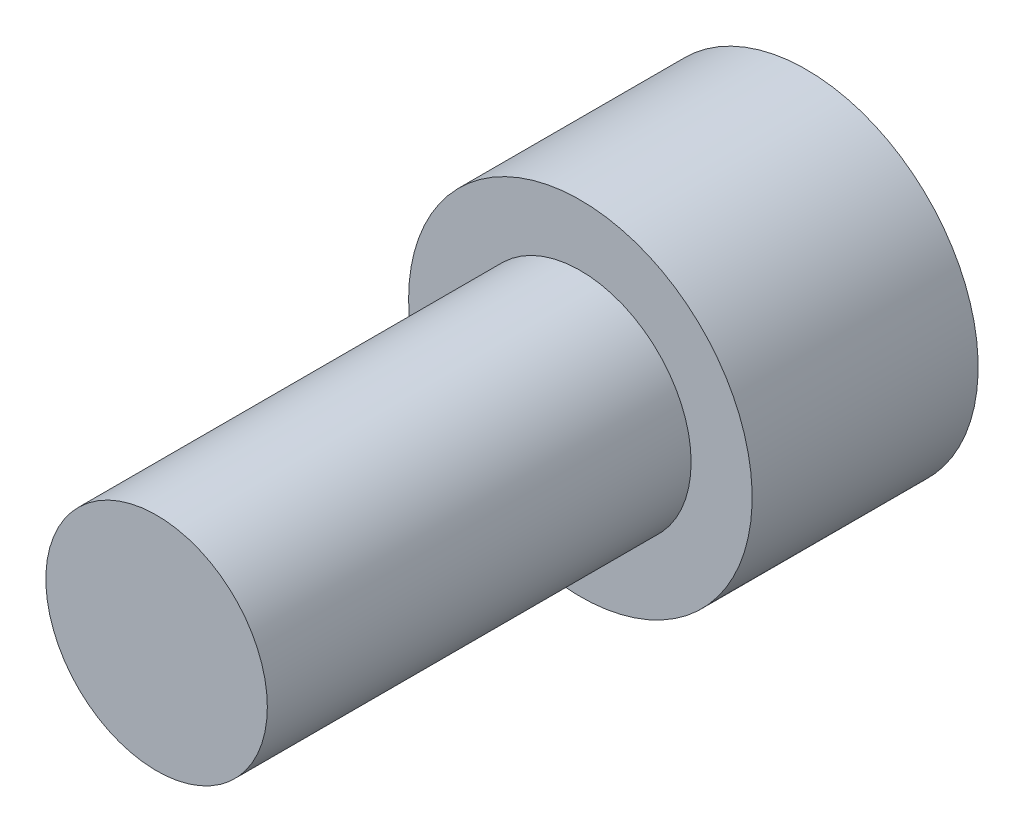
ISO-10303-21;
HEADER;
FILE_DESCRIPTION(('STEP AP214'),'2;1');
FILE_NAME('part.step','',(''),(''),'','','');
FILE_SCHEMA(('AUTOMOTIVE_DESIGN { 1 0 10303 214 1 1 1 1 }'));
ENDSEC;
DATA;
#1=APPLICATION_CONTEXT('core data for automotive mechanical design processes');
#2=APPLICATION_PROTOCOL_DEFINITION('international standard','automotive_design',2000,#1);
#3=PRODUCT_CONTEXT('',#1,'mechanical');
#4=PRODUCT('Part','Part','',(#3));
#5=PRODUCT_RELATED_PRODUCT_CATEGORY('part','',(#4));
#6=PRODUCT_DEFINITION_FORMATION('','',#4);
#7=PRODUCT_DEFINITION_CONTEXT('part definition',#1,'design');
#8=PRODUCT_DEFINITION('design','',#6,#7);
#9=PRODUCT_DEFINITION_SHAPE('','',#8);
#10=(LENGTH_UNIT() NAMED_UNIT(*) SI_UNIT(.MILLI.,.METRE.));
#11=(NAMED_UNIT(*) PLANE_ANGLE_UNIT() SI_UNIT($,.RADIAN.));
#12=(NAMED_UNIT(*) SI_UNIT($,.STERADIAN.) SOLID_ANGLE_UNIT());
#13=UNCERTAINTY_MEASURE_WITH_UNIT(LENGTH_MEASURE(1.E-05),#10,'distance_accuracy_value','');
#14=(GEOMETRIC_REPRESENTATION_CONTEXT(3) GLOBAL_UNCERTAINTY_ASSIGNED_CONTEXT((#13)) GLOBAL_UNIT_ASSIGNED_CONTEXT((#10,
#11,#12)) REPRESENTATION_CONTEXT('',''));
#15=CARTESIAN_POINT('',(0.,0.,0.));
#16=DIRECTION('',(0.,0.,1.));
#17=DIRECTION('',(1.,0.,0.));
#18=AXIS2_PLACEMENT_3D('',#15,#16,#17);
#19=CARTESIAN_POINT('',(0.,0.,14.605));
#20=DIRECTION('',(0.,0.,-1.));
#21=DIRECTION('',(-1.,0.,0.));
#22=AXIS2_PLACEMENT_3D('',#19,#20,#21);
#23=CYLINDRICAL_SURFACE('',#22,3.8608);
#24=CARTESIAN_POINT('',(0.,0.,0.));
#25=DIRECTION('',(0.,0.,1.));
#26=DIRECTION('',(1.,0.,0.));
#27=AXIS2_PLACEMENT_3D('',#24,#25,#26);
#28=CIRCLE('',#27,3.8608);
#29=CARTESIAN_POINT('',(-3.8608,0.,0.));
#30=VERTEX_POINT('',#29);
#31=EDGE_CURVE('E12',#30,#30,#28,.T.);
#32=CARTESIAN_POINT('',(0.,0.,5.08));
#33=DIRECTION('',(0.,0.,1.));
#34=DIRECTION('',(1.,0.,0.));
#35=AXIS2_PLACEMENT_3D('',#32,#33,#34);
#36=CIRCLE('',#35,3.8608);
#37=CARTESIAN_POINT('',(-3.8608,0.,5.08));
#38=VERTEX_POINT('',#37);
#39=EDGE_CURVE('E35',#38,#38,#36,.T.);
#40=CARTESIAN_POINT('',(-3.8608,0.,0.));
#41=CARTESIAN_POINT('',(-3.8608,0.,0.0529166666666664));
#42=CARTESIAN_POINT('',(-3.8608,0.,0.105833333333333));
#43=CARTESIAN_POINT('',(-3.8608,0.,0.211666666666666));
#44=CARTESIAN_POINT('',(-3.8608,0.,0.264583333333333));
#45=CARTESIAN_POINT('',(-3.8608,0.,0.370416666666666));
#46=CARTESIAN_POINT('',(-3.8608,0.,0.423333333333333));
#47=CARTESIAN_POINT('',(-3.8608,0.,0.529166666666666));
#48=CARTESIAN_POINT('',(-3.8608,0.,0.582083333333333));
#49=CARTESIAN_POINT('',(-3.8608,0.,0.687916666666667));
#50=CARTESIAN_POINT('',(-3.8608,0.,0.740833333333333));
#51=CARTESIAN_POINT('',(-3.8608,0.,0.846666666666666));
#52=CARTESIAN_POINT('',(-3.8608,0.,0.899583333333333));
#53=CARTESIAN_POINT('',(-3.8608,0.,1.00541666666667));
#54=CARTESIAN_POINT('',(-3.8608,0.,1.05833333333333));
#55=CARTESIAN_POINT('',(-3.8608,0.,1.16416666666667));
#56=CARTESIAN_POINT('',(-3.8608,0.,1.21708333333333));
#57=CARTESIAN_POINT('',(-3.8608,0.,1.32291666666667));
#58=CARTESIAN_POINT('',(-3.8608,0.,1.37583333333333));
#59=CARTESIAN_POINT('',(-3.8608,0.,1.48166666666667));
#60=CARTESIAN_POINT('',(-3.8608,0.,1.53458333333333));
#61=CARTESIAN_POINT('',(-3.8608,0.,1.64041666666667));
#62=CARTESIAN_POINT('',(-3.8608,0.,1.69333333333333));
#63=CARTESIAN_POINT('',(-3.8608,0.,1.79916666666667));
#64=CARTESIAN_POINT('',(-3.8608,0.,1.85208333333333));
#65=CARTESIAN_POINT('',(-3.8608,0.,1.95791666666667));
#66=CARTESIAN_POINT('',(-3.8608,0.,2.01083333333333));
#67=CARTESIAN_POINT('',(-3.8608,0.,2.11666666666667));
#68=CARTESIAN_POINT('',(-3.8608,0.,2.16958333333333));
#69=CARTESIAN_POINT('',(-3.8608,0.,2.27541666666667));
#70=CARTESIAN_POINT('',(-3.8608,0.,2.32833333333333));
#71=CARTESIAN_POINT('',(-3.8608,0.,2.43416666666666));
#72=CARTESIAN_POINT('',(-3.8608,0.,2.48708333333333));
#73=CARTESIAN_POINT('',(-3.8608,0.,2.59291666666667));
#74=CARTESIAN_POINT('',(-3.8608,0.,2.64583333333333));
#75=CARTESIAN_POINT('',(-3.8608,0.,2.75166666666667));
#76=CARTESIAN_POINT('',(-3.8608,0.,2.80458333333333));
#77=CARTESIAN_POINT('',(-3.8608,0.,2.91041666666667));
#78=CARTESIAN_POINT('',(-3.8608,0.,2.96333333333333));
#79=CARTESIAN_POINT('',(-3.8608,0.,3.06916666666667));
#80=CARTESIAN_POINT('',(-3.8608,0.,3.12208333333333));
#81=CARTESIAN_POINT('',(-3.8608,0.,3.22791666666667));
#82=CARTESIAN_POINT('',(-3.8608,0.,3.28083333333333));
#83=CARTESIAN_POINT('',(-3.8608,0.,3.38666666666666));
#84=CARTESIAN_POINT('',(-3.8608,0.,3.43958333333333));
#85=CARTESIAN_POINT('',(-3.8608,0.,3.54541666666667));
#86=CARTESIAN_POINT('',(-3.8608,0.,3.59833333333333));
#87=CARTESIAN_POINT('',(-3.8608,0.,3.70416666666666));
#88=CARTESIAN_POINT('',(-3.8608,0.,3.75708333333333));
#89=CARTESIAN_POINT('',(-3.8608,0.,3.86291666666666));
#90=CARTESIAN_POINT('',(-3.8608,0.,3.91583333333333));
#91=CARTESIAN_POINT('',(-3.8608,0.,4.02166666666667));
#92=CARTESIAN_POINT('',(-3.8608,0.,4.07458333333333));
#93=CARTESIAN_POINT('',(-3.8608,0.,4.18041666666667));
#94=CARTESIAN_POINT('',(-3.8608,0.,4.23333333333333));
#95=CARTESIAN_POINT('',(-3.8608,0.,4.33916666666666));
#96=CARTESIAN_POINT('',(-3.8608,0.,4.39208333333333));
#97=CARTESIAN_POINT('',(-3.8608,0.,4.49791666666666));
#98=CARTESIAN_POINT('',(-3.8608,0.,4.55083333333333));
#99=CARTESIAN_POINT('',(-3.8608,0.,4.65666666666666));
#100=CARTESIAN_POINT('',(-3.8608,0.,4.70958333333333));
#101=CARTESIAN_POINT('',(-3.8608,0.,4.81541666666666));
#102=CARTESIAN_POINT('',(-3.8608,0.,4.86833333333333));
#103=CARTESIAN_POINT('',(-3.8608,0.,4.97416666666667));
#104=CARTESIAN_POINT('',(-3.8608,0.,5.02708333333333));
#105=CARTESIAN_POINT('',(-3.8608,0.,5.08));
#106=B_SPLINE_CURVE_WITH_KNOTS('',3,(#40,#41,#42,#43,#44,#45,#46,#47,#48,#49,#50,#51,#52,#53,
#54,#55,#56,#57,#58,#59,#60,#61,#62,#63,#64,#65,#66,#67,#68,#69,#70,#71,#72,#73,#74,#75,#76,#77,
#78,#79,#80,#81,#82,#83,#84,#85,#86,#87,#88,#89,#90,#91,#92,#93,#94,#95,#96,#97,#98,#99,#100,
#101,#102,#103,#104,#105),.UNSPECIFIED.,.F.,.F.,(4,2,2,2,2,2,2,2,2,2,2,2,2,2,2,2,2,2,2,2,2,2,2,
2,2,2,2,2,2,2,2,2,4),(0.,0.158749999999999,0.3175,0.476249999999999,0.635,0.793749999999999,
0.9525,1.11125,1.27,1.42875,1.5875,1.74625,1.905,2.06375,2.2225,2.38125,2.54,2.69875,2.8575,
3.01625,3.175,3.33375,3.4925,3.65125,3.81,3.96875,4.1275,4.28625,4.445,4.60375,4.7625,4.92125,
5.08),.UNSPECIFIED.);
#107=EDGE_CURVE('BSEAM32',#30,#38,#106,.T.);
#108=ORIENTED_EDGE('',*,*,#31,.T.);
#109=ORIENTED_EDGE('',*,*,#39,.F.);
#110=ORIENTED_EDGE('',*,*,#107,.T.);
#111=ORIENTED_EDGE('',*,*,#107,.F.);
#112=EDGE_LOOP('',(#108,#110,#109,#111));
#113=FACE_BOUND('',#112,.T.);
#114=ADVANCED_FACE('F32',(#113),#23,.T.);
#115=CARTESIAN_POINT('',(0.,0.,0.));
#116=DIRECTION('',(0.,0.,1.));
#117=DIRECTION('',(1.,0.,0.));
#118=AXIS2_PLACEMENT_3D('',#115,#116,#117);
#119=PLANE('',#118);
#120=DIRECTION('',(0.866025403784438,-0.500000000000001,0.));
#121=VECTOR('',#120,1.);
#122=CARTESIAN_POINT('',(0.,2.98768394834781,0.));
#123=LINE('',#122,#121);
#124=CARTESIAN_POINT('',(0.,2.98768394834781,0.));
#125=VERTEX_POINT('',#124);
#126=CARTESIAN_POINT('',(2.5874101977482,1.4938419741739,0.));
#127=VERTEX_POINT('',#126);
#128=EDGE_CURVE('E120',#125,#127,#123,.T.);
#129=ORIENTED_EDGE('',*,*,#128,.F.);
#130=DIRECTION('',(0.866025403784442,0.499999999999995,0.));
#131=VECTOR('',#130,1.);
#132=CARTESIAN_POINT('',(-2.58741019774818,1.49384197417393,0.));
#133=LINE('',#132,#131);
#134=CARTESIAN_POINT('',(-2.58741019774818,1.49384197417393,0.));
#135=VERTEX_POINT('',#134);
#136=EDGE_CURVE('E46',#135,#125,#133,.T.);
#137=ORIENTED_EDGE('',*,*,#136,.F.);
#138=DIRECTION('',(0.,1.,0.));
#139=VECTOR('',#138,1.);
#140=CARTESIAN_POINT('',(-2.58741019774821,-1.49384197417388,0.));
#141=LINE('',#140,#139);
#142=CARTESIAN_POINT('',(-2.58741019774821,-1.49384197417388,0.));
#143=VERTEX_POINT('',#142);
#144=EDGE_CURVE('E129',#143,#135,#141,.T.);
#145=ORIENTED_EDGE('',*,*,#144,.F.);
#146=DIRECTION('',(-0.866025403784434,0.500000000000007,0.));
#147=VECTOR('',#146,1.);
#148=CARTESIAN_POINT('',(0.,-2.98768394834781,0.));
#149=LINE('',#148,#147);
#150=CARTESIAN_POINT('',(0.,-2.98768394834781,0.));
#151=VERTEX_POINT('',#150);
#152=EDGE_CURVE('E127',#151,#143,#149,.T.);
#153=ORIENTED_EDGE('',*,*,#152,.F.);
#154=DIRECTION('',(-0.866025403784442,-0.499999999999995,0.));
#155=VECTOR('',#154,1.);
#156=CARTESIAN_POINT('',(2.58741019774819,-1.49384197417392,0.));
#157=LINE('',#156,#155);
#158=CARTESIAN_POINT('',(2.58741019774819,-1.49384197417392,0.));
#159=VERTEX_POINT('',#158);
#160=EDGE_CURVE('E94',#159,#151,#157,.T.);
#161=ORIENTED_EDGE('',*,*,#160,.F.);
#162=DIRECTION('',(0.,-1.,0.));
#163=VECTOR('',#162,1.);
#164=CARTESIAN_POINT('',(2.5874101977482,1.4938419741739,0.));
#165=LINE('',#164,#163);
#166=EDGE_CURVE('E123',#127,#159,#165,.T.);
#167=ORIENTED_EDGE('',*,*,#166,.F.);
#168=EDGE_LOOP('',(#129,#137,#145,#153,#161,#167));
#169=FACE_BOUND('',#168,.T.);
#170=ORIENTED_EDGE('',*,*,#31,.F.);
#171=EDGE_LOOP('',(#170));
#172=FACE_BOUND('',#171,.T.);
#173=ADVANCED_FACE('F158',(#169,#172),#119,.F.);
#174=CARTESIAN_POINT('',(0.,0.,5.08));
#175=DIRECTION('',(0.,0.,1.));
#176=DIRECTION('',(1.,0.,0.));
#177=AXIS2_PLACEMENT_3D('',#174,#175,#176);
#178=PLANE('',#177);
#179=CARTESIAN_POINT('',(0.,0.,5.08));
#180=DIRECTION('',(0.,0.,1.));
#181=DIRECTION('',(1.,0.,0.));
#182=AXIS2_PLACEMENT_3D('',#179,#180,#181);
#183=CIRCLE('',#182,2.4892);
#184=CARTESIAN_POINT('',(2.4892,0.,5.08));
#185=VERTEX_POINT('',#184);
#186=EDGE_CURVE('E139',#185,#185,#183,.T.);
#187=ORIENTED_EDGE('',*,*,#186,.F.);
#188=EDGE_LOOP('',(#187));
#189=FACE_BOUND('',#188,.T.);
#190=ORIENTED_EDGE('',*,*,#39,.T.);
#191=EDGE_LOOP('',(#190));
#192=FACE_BOUND('',#191,.T.);
#193=ADVANCED_FACE('F149',(#189,#192),#178,.T.);
#194=CARTESIAN_POINT('',(0.,0.,5.08));
#195=DIRECTION('',(0.,0.,1.));
#196=DIRECTION('',(1.,0.,0.));
#197=AXIS2_PLACEMENT_3D('',#194,#195,#196);
#198=CYLINDRICAL_SURFACE('',#197,2.4892);
#199=CARTESIAN_POINT('',(0.,0.,14.605));
#200=DIRECTION('',(0.,0.,1.));
#201=DIRECTION('',(1.,0.,0.));
#202=AXIS2_PLACEMENT_3D('',#199,#200,#201);
#203=CIRCLE('',#202,2.4892);
#204=CARTESIAN_POINT('',(2.4892,0.,14.605));
#205=VERTEX_POINT('',#204);
#206=EDGE_CURVE('E133',#205,#205,#203,.T.);
#207=CARTESIAN_POINT('',(2.4892,0.,5.08));
#208=CARTESIAN_POINT('',(2.4892,0.,5.17921875));
#209=CARTESIAN_POINT('',(2.4892,0.,5.2784375));
#210=CARTESIAN_POINT('',(2.4892,0.,5.476875));
#211=CARTESIAN_POINT('',(2.4892,0.,5.57609375));
#212=CARTESIAN_POINT('',(2.4892,0.,5.77453125));
#213=CARTESIAN_POINT('',(2.4892,0.,5.87375));
#214=CARTESIAN_POINT('',(2.4892,0.,6.0721875));
#215=CARTESIAN_POINT('',(2.4892,0.,6.17140625));
#216=CARTESIAN_POINT('',(2.4892,0.,6.36984375));
#217=CARTESIAN_POINT('',(2.4892,0.,6.4690625));
#218=CARTESIAN_POINT('',(2.4892,0.,6.6675));
#219=CARTESIAN_POINT('',(2.4892,0.,6.76671875));
#220=CARTESIAN_POINT('',(2.4892,0.,6.96515625));
#221=CARTESIAN_POINT('',(2.4892,0.,7.064375));
#222=CARTESIAN_POINT('',(2.4892,0.,7.2628125));
#223=CARTESIAN_POINT('',(2.4892,0.,7.36203125));
#224=CARTESIAN_POINT('',(2.4892,0.,7.56046875));
#225=CARTESIAN_POINT('',(2.4892,0.,7.6596875));
#226=CARTESIAN_POINT('',(2.4892,0.,7.858125));
#227=CARTESIAN_POINT('',(2.4892,0.,7.95734375));
#228=CARTESIAN_POINT('',(2.4892,0.,8.15578125));
#229=CARTESIAN_POINT('',(2.4892,0.,8.255));
#230=CARTESIAN_POINT('',(2.4892,0.,8.4534375));
#231=CARTESIAN_POINT('',(2.4892,0.,8.55265625));
#232=CARTESIAN_POINT('',(2.4892,0.,8.75109375));
#233=CARTESIAN_POINT('',(2.4892,0.,8.8503125));
#234=CARTESIAN_POINT('',(2.4892,0.,9.04875));
#235=CARTESIAN_POINT('',(2.4892,0.,9.14796875));
#236=CARTESIAN_POINT('',(2.4892,0.,9.34640625));
#237=CARTESIAN_POINT('',(2.4892,0.,9.445625));
#238=CARTESIAN_POINT('',(2.4892,0.,9.6440625));
#239=CARTESIAN_POINT('',(2.4892,0.,9.74328125));
#240=CARTESIAN_POINT('',(2.4892,0.,9.94171875));
#241=CARTESIAN_POINT('',(2.4892,0.,10.0409375));
#242=CARTESIAN_POINT('',(2.4892,0.,10.239375));
#243=CARTESIAN_POINT('',(2.4892,0.,10.33859375));
#244=CARTESIAN_POINT('',(2.4892,0.,10.53703125));
#245=CARTESIAN_POINT('',(2.4892,0.,10.63625));
#246=CARTESIAN_POINT('',(2.4892,0.,10.8346875));
#247=CARTESIAN_POINT('',(2.4892,0.,10.93390625));
#248=CARTESIAN_POINT('',(2.4892,0.,11.13234375));
#249=CARTESIAN_POINT('',(2.4892,0.,11.2315625));
#250=CARTESIAN_POINT('',(2.4892,0.,11.43));
#251=CARTESIAN_POINT('',(2.4892,0.,11.52921875));
#252=CARTESIAN_POINT('',(2.4892,0.,11.72765625));
#253=CARTESIAN_POINT('',(2.4892,0.,11.826875));
#254=CARTESIAN_POINT('',(2.4892,0.,12.0253125));
#255=CARTESIAN_POINT('',(2.4892,0.,12.12453125));
#256=CARTESIAN_POINT('',(2.4892,0.,12.32296875));
#257=CARTESIAN_POINT('',(2.4892,0.,12.4221875));
#258=CARTESIAN_POINT('',(2.4892,0.,12.620625));
#259=CARTESIAN_POINT('',(2.4892,0.,12.71984375));
#260=CARTESIAN_POINT('',(2.4892,0.,12.91828125));
#261=CARTESIAN_POINT('',(2.4892,0.,13.0175));
#262=CARTESIAN_POINT('',(2.4892,0.,13.2159375));
#263=CARTESIAN_POINT('',(2.4892,0.,13.31515625));
#264=CARTESIAN_POINT('',(2.4892,0.,13.51359375));
#265=CARTESIAN_POINT('',(2.4892,0.,13.6128125));
#266=CARTESIAN_POINT('',(2.4892,0.,13.81125));
#267=CARTESIAN_POINT('',(2.4892,0.,13.91046875));
#268=CARTESIAN_POINT('',(2.4892,0.,14.10890625));
#269=CARTESIAN_POINT('',(2.4892,0.,14.208125));
#270=CARTESIAN_POINT('',(2.4892,0.,14.4065625));
#271=CARTESIAN_POINT('',(2.4892,0.,14.50578125));
#272=CARTESIAN_POINT('',(2.4892,0.,14.605));
#273=B_SPLINE_CURVE_WITH_KNOTS('',3,(#207,#208,#209,#210,#211,#212,#213,#214,#215,#216,#217,
#218,#219,#220,#221,#222,#223,#224,#225,#226,#227,#228,#229,#230,#231,#232,#233,#234,#235,#236,
#237,#238,#239,#240,#241,#242,#243,#244,#245,#246,#247,#248,#249,#250,#251,#252,#253,#254,#255,
#256,#257,#258,#259,#260,#261,#262,#263,#264,#265,#266,#267,#268,#269,#270,#271,#272),
.UNSPECIFIED.,.F.,.F.,(4,2,2,2,2,2,2,2,2,2,2,2,2,2,2,2,2,2,2,2,2,2,2,2,2,2,2,2,2,2,2,2,4),(0.,
0.29765625,0.5953125,0.892968750000001,1.190625,1.48828125,1.7859375,2.08359375,2.38125,
2.67890625,2.9765625,3.27421875,3.571875,3.86953125,4.1671875,4.46484375,4.7625,5.06015625,
5.3578125,5.65546875,5.953125,6.25078125,6.5484375,6.84609375,7.14375,7.44140625,7.7390625,
8.03671875,8.334375,8.63203125,8.9296875,9.22734375,9.525),.UNSPECIFIED.);
#274=EDGE_CURVE('BSEAM147',#185,#205,#273,.T.);
#275=ORIENTED_EDGE('',*,*,#186,.T.);
#276=ORIENTED_EDGE('',*,*,#206,.F.);
#277=ORIENTED_EDGE('',*,*,#274,.T.);
#278=ORIENTED_EDGE('',*,*,#274,.F.);
#279=EDGE_LOOP('',(#275,#277,#276,#278));
#280=FACE_BOUND('',#279,.T.);
#281=ADVANCED_FACE('F147',(#280),#198,.T.);
#282=CARTESIAN_POINT('',(0.,0.,14.605));
#283=DIRECTION('',(0.,0.,1.));
#284=DIRECTION('',(1.,0.,0.));
#285=AXIS2_PLACEMENT_3D('',#282,#283,#284);
#286=PLANE('',#285);
#287=ORIENTED_EDGE('',*,*,#206,.T.);
#288=EDGE_LOOP('',(#287));
#289=FACE_BOUND('',#288,.T.);
#290=ADVANCED_FACE('F145',(#289),#286,.T.);
#291=CARTESIAN_POINT('',(-2.58741019774818,1.49384197417393,3.048));
#292=DIRECTION('',(-0.499999999999995,0.866025403784442,0.));
#293=DIRECTION('',(-0.866025403784442,-0.499999999999995,0.));
#294=AXIS2_PLACEMENT_3D('',#291,#292,#293);
#295=PLANE('',#294);
#296=ORIENTED_EDGE('',*,*,#136,.T.);
#297=DIRECTION('',(0.,0.,-1.));
#298=VECTOR('',#297,1.);
#299=CARTESIAN_POINT('',(0.,2.98768394834781,3.048));
#300=LINE('',#299,#298);
#301=CARTESIAN_POINT('',(0.,2.98768394834781,3.048));
#302=VERTEX_POINT('',#301);
#303=EDGE_CURVE('E76',#302,#125,#300,.T.);
#304=ORIENTED_EDGE('',*,*,#303,.F.);
#305=DIRECTION('',(0.866025403784442,0.499999999999995,0.));
#306=VECTOR('',#305,1.);
#307=CARTESIAN_POINT('',(-2.58741019774818,1.49384197417393,3.048));
#308=LINE('',#307,#306);
#309=CARTESIAN_POINT('',(-2.58741019774818,1.49384197417393,3.048));
#310=VERTEX_POINT('',#309);
#311=EDGE_CURVE('E131',#310,#302,#308,.T.);
#312=ORIENTED_EDGE('',*,*,#311,.F.);
#313=DIRECTION('',(0.,0.,-1.));
#314=VECTOR('',#313,1.);
#315=CARTESIAN_POINT('',(-2.58741019774818,1.49384197417393,3.048));
#316=LINE('',#315,#314);
#317=EDGE_CURVE('E54',#310,#135,#316,.T.);
#318=ORIENTED_EDGE('',*,*,#317,.T.);
#319=EDGE_LOOP('',(#296,#304,#312,#318));
#320=FACE_BOUND('',#319,.T.);
#321=ADVANCED_FACE('F156',(#320),#295,.F.);
#322=CARTESIAN_POINT('',(-2.58741019774821,-1.49384197417388,3.048));
#323=DIRECTION('',(-1.,0.,0.));
#324=DIRECTION('',(0.,-1.,0.));
#325=AXIS2_PLACEMENT_3D('',#322,#323,#324);
#326=PLANE('',#325);
#327=ORIENTED_EDGE('',*,*,#144,.T.);
#328=ORIENTED_EDGE('',*,*,#317,.F.);
#329=DIRECTION('',(0.,1.,0.));
#330=VECTOR('',#329,1.);
#331=CARTESIAN_POINT('',(-2.58741019774821,-1.49384197417388,3.048));
#332=LINE('',#331,#330);
#333=CARTESIAN_POINT('',(-2.58741019774821,-1.49384197417388,3.048));
#334=VERTEX_POINT('',#333);
#335=EDGE_CURVE('E106',#334,#310,#332,.T.);
#336=ORIENTED_EDGE('',*,*,#335,.F.);
#337=DIRECTION('',(0.,0.,-1.));
#338=VECTOR('',#337,1.);
#339=CARTESIAN_POINT('',(-2.58741019774821,-1.49384197417388,3.048));
#340=LINE('',#339,#338);
#341=EDGE_CURVE('E98',#334,#143,#340,.T.);
#342=ORIENTED_EDGE('',*,*,#341,.T.);
#343=EDGE_LOOP('',(#327,#328,#336,#342));
#344=FACE_BOUND('',#343,.T.);
#345=ADVANCED_FACE('F183',(#344),#326,.F.);
#346=CARTESIAN_POINT('',(0.,-2.98768394834781,3.048));
#347=DIRECTION('',(-0.500000000000007,-0.866025403784435,0.));
#348=DIRECTION('',(0.866025403784435,-0.500000000000007,0.));
#349=AXIS2_PLACEMENT_3D('',#346,#347,#348);
#350=PLANE('',#349);
#351=ORIENTED_EDGE('',*,*,#152,.T.);
#352=ORIENTED_EDGE('',*,*,#341,.F.);
#353=DIRECTION('',(-0.866025403784434,0.500000000000007,0.));
#354=VECTOR('',#353,1.);
#355=CARTESIAN_POINT('',(0.,-2.98768394834781,3.048));
#356=LINE('',#355,#354);
#357=CARTESIAN_POINT('',(0.,-2.98768394834781,3.048));
#358=VERTEX_POINT('',#357);
#359=EDGE_CURVE('E102',#358,#334,#356,.T.);
#360=ORIENTED_EDGE('',*,*,#359,.F.);
#361=DIRECTION('',(0.,0.,-1.));
#362=VECTOR('',#361,1.);
#363=CARTESIAN_POINT('',(0.,-2.98768394834781,3.048));
#364=LINE('',#363,#362);
#365=EDGE_CURVE('E87',#358,#151,#364,.T.);
#366=ORIENTED_EDGE('',*,*,#365,.T.);
#367=EDGE_LOOP('',(#351,#352,#360,#366));
#368=FACE_BOUND('',#367,.T.);
#369=ADVANCED_FACE('F103',(#368),#350,.F.);
#370=CARTESIAN_POINT('',(2.58741019774819,-1.49384197417392,3.048));
#371=DIRECTION('',(0.499999999999995,-0.866025403784442,0.));
#372=DIRECTION('',(0.866025403784442,0.499999999999995,0.));
#373=AXIS2_PLACEMENT_3D('',#370,#371,#372);
#374=PLANE('',#373);
#375=ORIENTED_EDGE('',*,*,#160,.T.);
#376=ORIENTED_EDGE('',*,*,#365,.F.);
#377=DIRECTION('',(-0.866025403784442,-0.499999999999995,0.));
#378=VECTOR('',#377,1.);
#379=CARTESIAN_POINT('',(2.58741019774819,-1.49384197417392,3.048));
#380=LINE('',#379,#378);
#381=CARTESIAN_POINT('',(2.58741019774819,-1.49384197417392,3.048));
#382=VERTEX_POINT('',#381);
#383=EDGE_CURVE('E91',#382,#358,#380,.T.);
#384=ORIENTED_EDGE('',*,*,#383,.F.);
#385=DIRECTION('',(0.,0.,-1.));
#386=VECTOR('',#385,1.);
#387=CARTESIAN_POINT('',(2.58741019774819,-1.49384197417392,3.048));
#388=LINE('',#387,#386);
#389=EDGE_CURVE('E99',#382,#159,#388,.T.);
#390=ORIENTED_EDGE('',*,*,#389,.T.);
#391=EDGE_LOOP('',(#375,#376,#384,#390));
#392=FACE_BOUND('',#391,.T.);
#393=ADVANCED_FACE('F89',(#392),#374,.F.);
#394=CARTESIAN_POINT('',(2.5874101977482,1.4938419741739,3.048));
#395=DIRECTION('',(1.,0.,0.));
#396=DIRECTION('',(0.,1.,0.));
#397=AXIS2_PLACEMENT_3D('',#394,#395,#396);
#398=PLANE('',#397);
#399=ORIENTED_EDGE('',*,*,#166,.T.);
#400=ORIENTED_EDGE('',*,*,#389,.F.);
#401=DIRECTION('',(0.,-1.,0.));
#402=VECTOR('',#401,1.);
#403=CARTESIAN_POINT('',(2.5874101977482,1.4938419741739,3.048));
#404=LINE('',#403,#402);
#405=CARTESIAN_POINT('',(2.5874101977482,1.4938419741739,3.048));
#406=VERTEX_POINT('',#405);
#407=EDGE_CURVE('E112',#406,#382,#404,.T.);
#408=ORIENTED_EDGE('',*,*,#407,.F.);
#409=DIRECTION('',(0.,0.,-1.));
#410=VECTOR('',#409,1.);
#411=CARTESIAN_POINT('',(2.5874101977482,1.4938419741739,3.048));
#412=LINE('',#411,#410);
#413=EDGE_CURVE('E136',#406,#127,#412,.T.);
#414=ORIENTED_EDGE('',*,*,#413,.T.);
#415=EDGE_LOOP('',(#399,#400,#408,#414));
#416=FACE_BOUND('',#415,.T.);
#417=ADVANCED_FACE('F191',(#416),#398,.F.);
#418=CARTESIAN_POINT('',(0.,2.98768394834781,3.048));
#419=DIRECTION('',(0.500000000000001,0.866025403784438,0.));
#420=DIRECTION('',(-0.866025403784438,0.500000000000001,0.));
#421=AXIS2_PLACEMENT_3D('',#418,#419,#420);
#422=PLANE('',#421);
#423=ORIENTED_EDGE('',*,*,#128,.T.);
#424=ORIENTED_EDGE('',*,*,#413,.F.);
#425=DIRECTION('',(0.866025403784438,-0.500000000000001,0.));
#426=VECTOR('',#425,1.);
#427=CARTESIAN_POINT('',(0.,2.98768394834781,3.048));
#428=LINE('',#427,#426);
#429=EDGE_CURVE('E114',#302,#406,#428,.T.);
#430=ORIENTED_EDGE('',*,*,#429,.F.);
#431=ORIENTED_EDGE('',*,*,#303,.T.);
#432=EDGE_LOOP('',(#423,#424,#430,#431));
#433=FACE_BOUND('',#432,.T.);
#434=ADVANCED_FACE('F180',(#433),#422,.F.);
#435=CARTESIAN_POINT('',(0.,2.98768394834781,3.048));
#436=DIRECTION('',(0.,0.,-1.));
#437=DIRECTION('',(-1.,0.,0.));
#438=AXIS2_PLACEMENT_3D('',#435,#436,#437);
#439=PLANE('',#438);
#440=ORIENTED_EDGE('',*,*,#311,.T.);
#441=ORIENTED_EDGE('',*,*,#429,.T.);
#442=ORIENTED_EDGE('',*,*,#407,.T.);
#443=ORIENTED_EDGE('',*,*,#383,.T.);
#444=ORIENTED_EDGE('',*,*,#359,.T.);
#445=ORIENTED_EDGE('',*,*,#335,.T.);
#446=EDGE_LOOP('',(#440,#441,#442,#443,#444,#445));
#447=FACE_BOUND('',#446,.T.);
#448=ADVANCED_FACE('F109',(#447),#439,.T.);
#449=CLOSED_SHELL('',(#114,#173,#193,#281,#290,#321,#345,#369,#393,#417,#434,#448));
#450=MANIFOLD_SOLID_BREP('B2',#449);
#451=ADVANCED_BREP_SHAPE_REPRESENTATION('',(#18,#450),#14);
#452=SHAPE_DEFINITION_REPRESENTATION(#9,#451);
ENDSEC;
END-ISO-10303-21;
